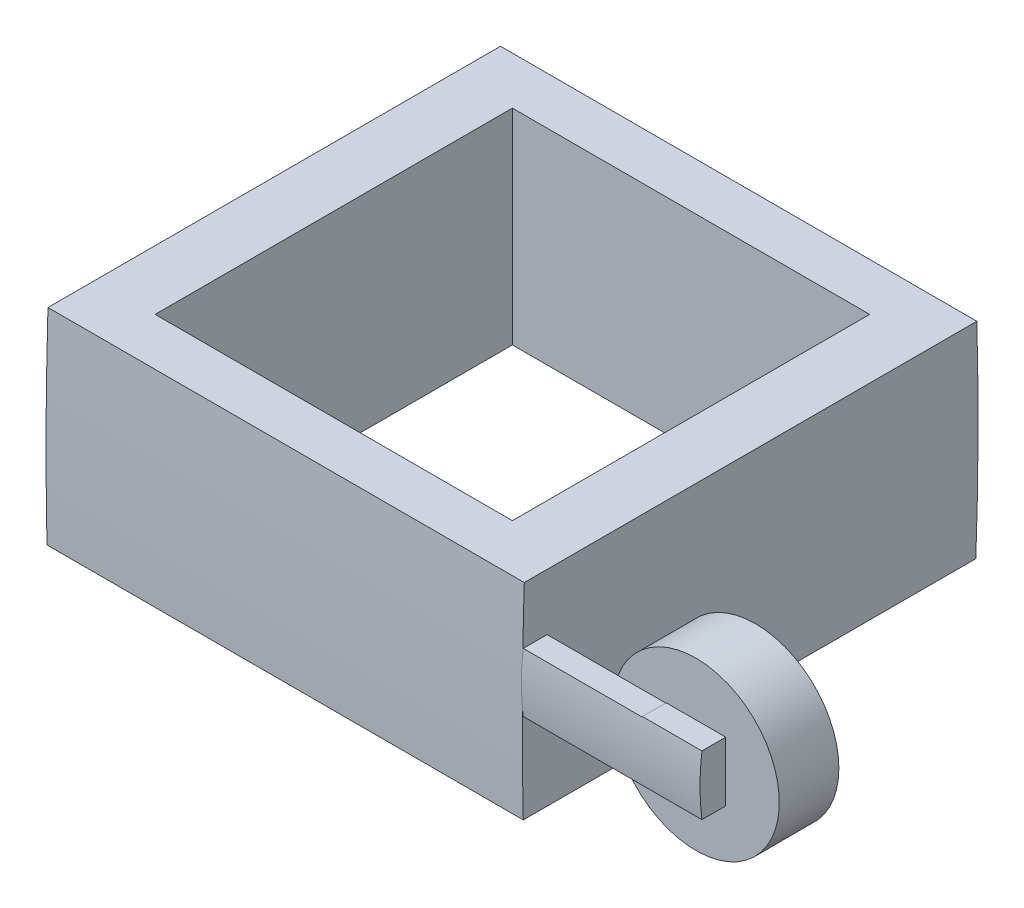
ISO-10303-21;
HEADER;
FILE_DESCRIPTION(('STEP AP214'),'2;1');
FILE_NAME('part.step','',(''),(''),'','','');
FILE_SCHEMA(('AUTOMOTIVE_DESIGN { 1 0 10303 214 1 1 1 1 }'));
ENDSEC;
DATA;
#1=APPLICATION_CONTEXT('core data for automotive mechanical design processes');
#2=APPLICATION_PROTOCOL_DEFINITION('international standard','automotive_design',2000,#1);
#3=PRODUCT_CONTEXT('',#1,'mechanical');
#4=PRODUCT('Part','Part','',(#3));
#5=PRODUCT_RELATED_PRODUCT_CATEGORY('part','',(#4));
#6=PRODUCT_DEFINITION_FORMATION('','',#4);
#7=PRODUCT_DEFINITION_CONTEXT('part definition',#1,'design');
#8=PRODUCT_DEFINITION('design','',#6,#7);
#9=PRODUCT_DEFINITION_SHAPE('','',#8);
#10=(LENGTH_UNIT() NAMED_UNIT(*) SI_UNIT(.MILLI.,.METRE.));
#11=(NAMED_UNIT(*) PLANE_ANGLE_UNIT() SI_UNIT($,.RADIAN.));
#12=(NAMED_UNIT(*) SI_UNIT($,.STERADIAN.) SOLID_ANGLE_UNIT());
#13=UNCERTAINTY_MEASURE_WITH_UNIT(LENGTH_MEASURE(1.E-05),#10,'distance_accuracy_value','');
#14=(GEOMETRIC_REPRESENTATION_CONTEXT(3) GLOBAL_UNCERTAINTY_ASSIGNED_CONTEXT((#13)) GLOBAL_UNIT_ASSIGNED_CONTEXT((#10,
#11,#12)) REPRESENTATION_CONTEXT('',''));
#15=CARTESIAN_POINT('',(0.,0.,0.));
#16=DIRECTION('',(0.,0.,1.));
#17=DIRECTION('',(1.,0.,0.));
#18=AXIS2_PLACEMENT_3D('',#15,#16,#17);
#19=CARTESIAN_POINT('',(0.,0.,10.));
#20=DIRECTION('',(0.,0.,1.));
#21=DIRECTION('',(1.,0.,0.));
#22=AXIS2_PLACEMENT_3D('',#19,#20,#21);
#23=PLANE('',#22);
#24=DIRECTION('',(1.,0.,0.));
#25=VECTOR('',#24,1.);
#26=CARTESIAN_POINT('',(-5.,-5.,10.));
#27=LINE('',#26,#25);
#28=CARTESIAN_POINT('',(-13.076696830622,-5.,10.));
#29=VERTEX_POINT('',#28);
#30=CARTESIAN_POINT('',(5.,-5.,10.));
#31=VERTEX_POINT('',#30);
#32=EDGE_CURVE('E261',#29,#31,#27,.T.);
#33=ORIENTED_EDGE('',*,*,#32,.F.);
#34=CARTESIAN_POINT('',(0.,0.,10.));
#35=DIRECTION('',(0.,0.,1.));
#36=DIRECTION('',(1.,0.,0.));
#37=AXIS2_PLACEMENT_3D('',#34,#35,#36);
#38=CIRCLE('',#37,14.);
#39=CARTESIAN_POINT('',(-13.1096817143984,4.91286528892942,10.));
#40=VERTEX_POINT('',#39);
#41=EDGE_CURVE('E281',#29,#40,#38,.T.);
#42=ORIENTED_EDGE('',*,*,#41,.T.);
#43=DIRECTION('',(1.,0.,0.));
#44=VECTOR('',#43,1.);
#45=CARTESIAN_POINT('',(-25.,4.91286528892942,10.));
#46=LINE('',#45,#44);
#47=CARTESIAN_POINT('',(-5.,4.91286528892942,10.));
#48=VERTEX_POINT('',#47);
#49=EDGE_CURVE('E244',#40,#48,#46,.T.);
#50=ORIENTED_EDGE('',*,*,#49,.T.);
#51=DIRECTION('',(0.,-1.,0.));
#52=VECTOR('',#51,1.);
#53=CARTESIAN_POINT('',(-5.,5.,10.));
#54=LINE('',#53,#52);
#55=CARTESIAN_POINT('',(-5.,5.,10.));
#56=VERTEX_POINT('',#55);
#57=EDGE_CURVE('E258',#56,#48,#54,.T.);
#58=ORIENTED_EDGE('',*,*,#57,.F.);
#59=DIRECTION('',(-1.,0.,0.));
#60=VECTOR('',#59,1.);
#61=CARTESIAN_POINT('',(-5.,5.,10.));
#62=LINE('',#61,#60);
#63=CARTESIAN_POINT('',(5.,5.,10.));
#64=VERTEX_POINT('',#63);
#65=EDGE_CURVE('E255',#64,#56,#62,.T.);
#66=ORIENTED_EDGE('',*,*,#65,.F.);
#67=DIRECTION('',(0.,1.,0.));
#68=VECTOR('',#67,1.);
#69=CARTESIAN_POINT('',(5.,5.,10.));
#70=LINE('',#69,#68);
#71=EDGE_CURVE('E252',#31,#64,#70,.T.);
#72=ORIENTED_EDGE('',*,*,#71,.F.);
#73=EDGE_LOOP('',(#33,#42,#50,#58,#66,#72));
#74=FACE_BOUND('',#73,.T.);
#75=ADVANCED_FACE('F33',(#74),#23,.T.);
#76=CARTESIAN_POINT('',(-5.,5.,18.));
#77=DIRECTION('',(1.,0.,0.));
#78=DIRECTION('',(0.,1.,0.));
#79=AXIS2_PLACEMENT_3D('',#76,#77,#78);
#80=PLANE('',#79);
#81=DIRECTION('',(0.,0.,-1.));
#82=VECTOR('',#81,1.);
#83=CARTESIAN_POINT('',(-5.,4.91286528892942,10.));
#84=LINE('',#83,#82);
#85=CARTESIAN_POINT('',(-5.,4.91286528892942,14.0114631277404));
#86=VERTEX_POINT('',#85);
#87=EDGE_CURVE('E234',#86,#48,#84,.T.);
#88=ORIENTED_EDGE('',*,*,#87,.F.);
#89=CARTESIAN_POINT('',(-5.,0.,-23.6696164036747));
#90=DIRECTION('',(1.,0.,0.));
#91=DIRECTION('',(0.,1.,0.));
#92=AXIS2_PLACEMENT_3D('',#89,#90,#91);
#93=CIRCLE('',#92,38.);
#94=CARTESIAN_POINT('',(-5.,5.,14.));
#95=VERTEX_POINT('',#94);
#96=EDGE_CURVE('E231',#86,#95,#93,.F.);
#97=ORIENTED_EDGE('',*,*,#96,.T.);
#98=DIRECTION('',(0.,0.,-1.));
#99=VECTOR('',#98,1.);
#100=CARTESIAN_POINT('',(-5.,5.,18.));
#101=LINE('',#100,#99);
#102=EDGE_CURVE('E266',#95,#56,#101,.T.);
#103=ORIENTED_EDGE('',*,*,#102,.T.);
#104=ORIENTED_EDGE('',*,*,#57,.T.);
#105=EDGE_LOOP('',(#88,#97,#103,#104));
#106=FACE_BOUND('',#105,.T.);
#107=ADVANCED_FACE('F312',(#106),#80,.F.);
#108=CARTESIAN_POINT('',(0.,0.,10.));
#109=DIRECTION('',(0.,0.,-1.));
#110=DIRECTION('',(-1.,0.,0.));
#111=AXIS2_PLACEMENT_3D('',#108,#109,#110);
#112=CYLINDRICAL_SURFACE('',#111,14.);
#113=EDGE_CURVE('E42',#40,#29,#38,.T.);
#114=ORIENTED_EDGE('',*,*,#113,.F.);
#115=ORIENTED_EDGE('',*,*,#41,.F.);
#116=EDGE_LOOP('',(#114,#115));
#117=FACE_BOUND('',#116,.T.);
#118=CARTESIAN_POINT('',(0.,0.,0.));
#119=DIRECTION('',(0.,0.,1.));
#120=DIRECTION('',(1.,0.,0.));
#121=AXIS2_PLACEMENT_3D('',#118,#119,#120);
#122=CIRCLE('',#121,14.);
#123=CARTESIAN_POINT('',(14.,0.,0.));
#124=VERTEX_POINT('',#123);
#125=EDGE_CURVE('E279',#124,#124,#122,.T.);
#126=ORIENTED_EDGE('',*,*,#125,.T.);
#127=EDGE_LOOP('',(#126));
#128=FACE_BOUND('',#127,.T.);
#129=ADVANCED_FACE('F35',(#117,#128),#112,.T.);
#130=CARTESIAN_POINT('',(0.,0.,0.));
#131=DIRECTION('',(0.,0.,1.));
#132=DIRECTION('',(1.,0.,0.));
#133=AXIS2_PLACEMENT_3D('',#130,#131,#132);
#134=PLANE('',#133);
#135=CARTESIAN_POINT('',(0.,0.,0.));
#136=DIRECTION('',(0.,0.,-1.));
#137=DIRECTION('',(-1.,0.,0.));
#138=AXIS2_PLACEMENT_3D('',#135,#136,#137);
#139=CIRCLE('',#138,5.);
#140=CARTESIAN_POINT('',(-5.,0.,0.));
#141=VERTEX_POINT('',#140);
#142=EDGE_CURVE('E270',#141,#141,#139,.T.);
#143=ORIENTED_EDGE('',*,*,#142,.F.);
#144=EDGE_LOOP('',(#143));
#145=FACE_BOUND('',#144,.T.);
#146=ORIENTED_EDGE('',*,*,#125,.F.);
#147=EDGE_LOOP('',(#146));
#148=FACE_BOUND('',#147,.T.);
#149=ADVANCED_FACE('F363',(#145,#148),#134,.F.);
#150=CARTESIAN_POINT('',(0.,0.,1.8));
#151=DIRECTION('',(0.,0.,-1.));
#152=DIRECTION('',(-1.,0.,0.));
#153=AXIS2_PLACEMENT_3D('',#150,#151,#152);
#154=PLANE('',#153);
#155=CARTESIAN_POINT('',(0.,0.,1.8));
#156=DIRECTION('',(0.,0.,-1.));
#157=DIRECTION('',(-1.,0.,0.));
#158=AXIS2_PLACEMENT_3D('',#155,#156,#157);
#159=CIRCLE('',#158,5.);
#160=CARTESIAN_POINT('',(-5.,0.,1.8));
#161=VERTEX_POINT('',#160);
#162=EDGE_CURVE('E271',#161,#161,#159,.T.);
#163=ORIENTED_EDGE('',*,*,#162,.T.);
#164=EDGE_LOOP('',(#163));
#165=FACE_BOUND('',#164,.T.);
#166=CARTESIAN_POINT('',(0.,0.,1.8));
#167=DIRECTION('',(0.,0.,-1.));
#168=DIRECTION('',(-1.,0.,0.));
#169=AXIS2_PLACEMENT_3D('',#166,#167,#168);
#170=CIRCLE('',#169,2.25);
#171=CARTESIAN_POINT('',(-2.25,0.,1.8));
#172=VERTEX_POINT('',#171);
#173=EDGE_CURVE('E37',#172,#172,#170,.F.);
#174=ORIENTED_EDGE('',*,*,#173,.T.);
#175=EDGE_LOOP('',(#174));
#176=FACE_BOUND('',#175,.T.);
#177=ADVANCED_FACE('F365',(#165,#176),#154,.T.);
#178=CARTESIAN_POINT('',(0.,0.,1.8));
#179=DIRECTION('',(0.,0.,-1.));
#180=DIRECTION('',(-1.,0.,0.));
#181=AXIS2_PLACEMENT_3D('',#178,#179,#180);
#182=CYLINDRICAL_SURFACE('',#181,5.);
#183=ORIENTED_EDGE('',*,*,#162,.F.);
#184=EDGE_LOOP('',(#183));
#185=FACE_BOUND('',#184,.T.);
#186=ORIENTED_EDGE('',*,*,#142,.T.);
#187=EDGE_LOOP('',(#186));
#188=FACE_BOUND('',#187,.T.);
#189=ADVANCED_FACE('F371',(#185,#188),#182,.F.);
#190=CARTESIAN_POINT('',(0.,0.,5.));
#191=DIRECTION('',(0.,0.,-1.));
#192=DIRECTION('',(-1.,0.,0.));
#193=AXIS2_PLACEMENT_3D('',#190,#191,#192);
#194=PLANE('',#193);
#195=CARTESIAN_POINT('',(0.,0.,5.));
#196=DIRECTION('',(0.,0.,-1.));
#197=DIRECTION('',(-1.,0.,0.));
#198=AXIS2_PLACEMENT_3D('',#195,#196,#197);
#199=CIRCLE('',#198,2.25);
#200=CARTESIAN_POINT('',(-2.25,0.,5.));
#201=VERTEX_POINT('',#200);
#202=EDGE_CURVE('E276',#201,#201,#199,.T.);
#203=ORIENTED_EDGE('',*,*,#202,.T.);
#204=EDGE_LOOP('',(#203));
#205=FACE_BOUND('',#204,.T.);
#206=ADVANCED_FACE('F378',(#205),#194,.T.);
#207=CARTESIAN_POINT('',(0.,0.,5.));
#208=DIRECTION('',(0.,0.,-1.));
#209=DIRECTION('',(-1.,0.,0.));
#210=AXIS2_PLACEMENT_3D('',#207,#208,#209);
#211=CYLINDRICAL_SURFACE('',#210,2.25);
#212=ORIENTED_EDGE('',*,*,#202,.F.);
#213=EDGE_LOOP('',(#212));
#214=FACE_BOUND('',#213,.T.);
#215=ORIENTED_EDGE('',*,*,#173,.F.);
#216=EDGE_LOOP('',(#215));
#217=FACE_BOUND('',#216,.T.);
#218=ADVANCED_FACE('F361',(#214,#217),#211,.F.);
#219=CARTESIAN_POINT('',(5.,5.,18.));
#220=DIRECTION('',(-1.,0.,0.));
#221=DIRECTION('',(0.,-1.,0.));
#222=AXIS2_PLACEMENT_3D('',#219,#220,#221);
#223=PLANE('',#222);
#224=DIRECTION('',(0.,0.,-1.));
#225=VECTOR('',#224,1.);
#226=CARTESIAN_POINT('',(5.,5.,18.));
#227=LINE('',#226,#225);
#228=CARTESIAN_POINT('',(5.,5.,14.));
#229=VERTEX_POINT('',#228);
#230=EDGE_CURVE('E268',#229,#64,#227,.T.);
#231=ORIENTED_EDGE('',*,*,#230,.F.);
#232=CARTESIAN_POINT('',(5.,0.,-23.6696164036747));
#233=DIRECTION('',(-1.,0.,0.));
#234=DIRECTION('',(0.,-1.,0.));
#235=AXIS2_PLACEMENT_3D('',#232,#233,#234);
#236=CIRCLE('',#235,38.);
#237=CARTESIAN_POINT('',(5.,-5.,14.));
#238=VERTEX_POINT('',#237);
#239=EDGE_CURVE('E216',#238,#229,#236,.T.);
#240=ORIENTED_EDGE('',*,*,#239,.F.);
#241=DIRECTION('',(0.,0.,-1.));
#242=VECTOR('',#241,1.);
#243=CARTESIAN_POINT('',(5.,-5.,18.));
#244=LINE('',#243,#242);
#245=EDGE_CURVE('E264',#238,#31,#244,.T.);
#246=ORIENTED_EDGE('',*,*,#245,.T.);
#247=ORIENTED_EDGE('',*,*,#71,.T.);
#248=EDGE_LOOP('',(#231,#240,#246,#247));
#249=FACE_BOUND('',#248,.T.);
#250=ADVANCED_FACE('F320',(#249),#223,.F.);
#251=CARTESIAN_POINT('',(-5.,5.,18.));
#252=DIRECTION('',(0.,-1.,0.));
#253=DIRECTION('',(0.,0.,-1.));
#254=AXIS2_PLACEMENT_3D('',#251,#252,#253);
#255=PLANE('',#254);
#256=ORIENTED_EDGE('',*,*,#102,.F.);
#257=DIRECTION('',(1.,0.,0.));
#258=VECTOR('',#257,1.);
#259=CARTESIAN_POINT('',(-25.,5.,14.));
#260=LINE('',#259,#258);
#261=EDGE_CURVE('E224',#95,#229,#260,.T.);
#262=ORIENTED_EDGE('',*,*,#261,.T.);
#263=ORIENTED_EDGE('',*,*,#230,.T.);
#264=ORIENTED_EDGE('',*,*,#65,.T.);
#265=EDGE_LOOP('',(#256,#262,#263,#264));
#266=FACE_BOUND('',#265,.T.);
#267=ADVANCED_FACE('F316',(#266),#255,.F.);
#268=CARTESIAN_POINT('',(-5.,-5.,18.));
#269=DIRECTION('',(0.,1.,0.));
#270=DIRECTION('',(0.,0.,1.));
#271=AXIS2_PLACEMENT_3D('',#268,#269,#270);
#272=PLANE('',#271);
#273=ORIENTED_EDGE('',*,*,#245,.F.);
#274=DIRECTION('',(1.,0.,0.));
#275=VECTOR('',#274,1.);
#276=CARTESIAN_POINT('',(-25.,-5.,14.));
#277=LINE('',#276,#275);
#278=CARTESIAN_POINT('',(-25.,-5.,14.));
#279=VERTEX_POINT('',#278);
#280=EDGE_CURVE('E220',#279,#238,#277,.T.);
#281=ORIENTED_EDGE('',*,*,#280,.F.);
#282=DIRECTION('',(0.,0.,1.));
#283=VECTOR('',#282,1.);
#284=CARTESIAN_POINT('',(-25.,-5.,10.));
#285=LINE('',#284,#283);
#286=CARTESIAN_POINT('',(-25.,-5.,10.));
#287=VERTEX_POINT('',#286);
#288=EDGE_CURVE('E238',#287,#279,#285,.T.);
#289=ORIENTED_EDGE('',*,*,#288,.F.);
#290=DIRECTION('',(1.,0.,0.));
#291=VECTOR('',#290,1.);
#292=CARTESIAN_POINT('',(-25.,-5.,10.));
#293=LINE('',#292,#291);
#294=EDGE_CURVE('E249',#287,#29,#293,.T.);
#295=ORIENTED_EDGE('',*,*,#294,.T.);
#296=ORIENTED_EDGE('',*,*,#32,.T.);
#297=EDGE_LOOP('',(#273,#281,#289,#295,#296));
#298=FACE_BOUND('',#297,.T.);
#299=ADVANCED_FACE('F299',(#298),#272,.F.);
#300=CARTESIAN_POINT('',(-25.,4.91286528892942,10.));
#301=DIRECTION('',(0.,0.,1.));
#302=DIRECTION('',(1.,0.,0.));
#303=AXIS2_PLACEMENT_3D('',#300,#301,#302);
#304=PLANE('',#303);
#305=CARTESIAN_POINT('',(-25.,4.91286528892942,10.));
#306=VERTEX_POINT('',#305);
#307=EDGE_CURVE('E246',#306,#40,#46,.T.);
#308=ORIENTED_EDGE('',*,*,#307,.T.);
#309=ORIENTED_EDGE('',*,*,#113,.T.);
#310=ORIENTED_EDGE('',*,*,#294,.F.);
#311=DIRECTION('',(0.,-1.,0.));
#312=VECTOR('',#311,1.);
#313=CARTESIAN_POINT('',(-25.,4.91286528892942,10.));
#314=LINE('',#313,#312);
#315=EDGE_CURVE('E235',#306,#287,#314,.T.);
#316=ORIENTED_EDGE('',*,*,#315,.F.);
#317=EDGE_LOOP('',(#308,#309,#310,#316));
#318=FACE_BOUND('',#317,.T.);
#319=ADVANCED_FACE('F295',(#318),#304,.F.);
#320=CARTESIAN_POINT('',(-25.,4.91286528892942,10.));
#321=DIRECTION('',(0.,-1.,0.));
#322=DIRECTION('',(1.,0.,0.));
#323=AXIS2_PLACEMENT_3D('',#320,#321,#322);
#324=PLANE('',#323);
#325=DIRECTION('',(0.,0.,-1.));
#326=VECTOR('',#325,1.);
#327=CARTESIAN_POINT('',(-25.,4.91286528892942,10.));
#328=LINE('',#327,#326);
#329=CARTESIAN_POINT('',(-25.,4.91286528892942,14.0114631277404));
#330=VERTEX_POINT('',#329);
#331=EDGE_CURVE('E241',#330,#306,#328,.T.);
#332=ORIENTED_EDGE('',*,*,#331,.F.);
#333=DIRECTION('',(1.,0.,0.));
#334=VECTOR('',#333,1.);
#335=CARTESIAN_POINT('',(-25.,4.91286528892942,14.0114631277404));
#336=LINE('',#335,#334);
#337=EDGE_CURVE('E227',#330,#86,#336,.T.);
#338=ORIENTED_EDGE('',*,*,#337,.T.);
#339=ORIENTED_EDGE('',*,*,#87,.T.);
#340=ORIENTED_EDGE('',*,*,#49,.F.);
#341=ORIENTED_EDGE('',*,*,#307,.F.);
#342=EDGE_LOOP('',(#332,#338,#339,#340,#341));
#343=FACE_BOUND('',#342,.T.);
#344=ADVANCED_FACE('F309',(#343),#324,.F.);
#345=CARTESIAN_POINT('',(-25.,0.,0.));
#346=DIRECTION('',(-1.,0.,0.));
#347=DIRECTION('',(0.,-1.,0.));
#348=AXIS2_PLACEMENT_3D('',#345,#346,#347);
#349=PLANE('',#348);
#350=CARTESIAN_POINT('',(-25.,-5.83938739683854,-602.069122819706));
#351=DIRECTION('',(-1.,0.,0.));
#352=DIRECTION('',(0.,1.,0.));
#353=AXIS2_PLACEMENT_3D('',#350,#351,#352);
#354=CIRCLE('',#353,616.232847891234);
#355=CARTESIAN_POINT('',(-25.,-3.5981456585402,14.1596493547289));
#356=VERTEX_POINT('',#355);
#357=CARTESIAN_POINT('',(-25.,4.36116541292893,14.0792939943893));
#358=VERTEX_POINT('',#357);
#359=EDGE_CURVE('E11',#356,#358,#354,.T.);
#360=ORIENTED_EDGE('',*,*,#359,.F.);
#361=CARTESIAN_POINT('',(-25.,0.,-23.6696164036747));
#362=DIRECTION('',(-1.,0.,0.));
#363=DIRECTION('',(0.,-1.,0.));
#364=AXIS2_PLACEMENT_3D('',#361,#362,#363);
#365=CIRCLE('',#364,38.);
#366=EDGE_CURVE('E221',#356,#358,#365,.T.);
#367=ORIENTED_EDGE('',*,*,#366,.T.);
#368=EDGE_LOOP('',(#360,#367));
#369=FACE_BOUND('',#368,.T.);
#370=ADVANCED_FACE('F325',(#369),#349,.T.);
#371=CARTESIAN_POINT('',(-25.,0.,-23.6696164036747));
#372=DIRECTION('',(1.,0.,0.));
#373=DIRECTION('',(0.,1.,0.));
#374=AXIS2_PLACEMENT_3D('',#371,#372,#373);
#375=CYLINDRICAL_SURFACE('',#374,38.);
#376=ORIENTED_EDGE('',*,*,#337,.F.);
#377=EDGE_CURVE('E222',#358,#330,#365,.T.);
#378=ORIENTED_EDGE('',*,*,#377,.F.);
#379=ORIENTED_EDGE('',*,*,#366,.F.);
#380=EDGE_CURVE('E217',#279,#356,#365,.T.);
#381=ORIENTED_EDGE('',*,*,#380,.F.);
#382=ORIENTED_EDGE('',*,*,#280,.T.);
#383=ORIENTED_EDGE('',*,*,#239,.T.);
#384=ORIENTED_EDGE('',*,*,#261,.F.);
#385=ORIENTED_EDGE('',*,*,#96,.F.);
#386=EDGE_LOOP('',(#376,#378,#379,#381,#382,#383,#384,#385));
#387=FACE_BOUND('',#386,.T.);
#388=ADVANCED_FACE('F322',(#387),#375,.T.);
#389=CARTESIAN_POINT('',(-105.,-0.220068821104443,468.323560821229));
#390=DIRECTION('',(1.,0.,0.));
#391=DIRECTION('',(0.,1.,0.));
#392=AXIS2_PLACEMENT_3D('',#389,#390,#391);
#393=CYLINDRICAL_SURFACE('',#392,530.693932748672);
#394=CARTESIAN_POINT('',(-25.,-0.220068821104429,468.323560821229));
#395=DIRECTION('',(-1.,0.,0.));
#396=DIRECTION('',(0.,1.,0.));
#397=AXIS2_PLACEMENT_3D('',#394,#395,#396);
#398=CIRCLE('',#397,530.693932748672);
#399=CARTESIAN_POINT('',(-25.,14.4035859028628,-62.1688509800772));
#400=VERTEX_POINT('',#399);
#401=CARTESIAN_POINT('',(-25.,-20.0435673555353,-62.0000000000001));
#402=VERTEX_POINT('',#401);
#403=EDGE_CURVE('E187',#400,#402,#398,.T.);
#404=ORIENTED_EDGE('',*,*,#403,.T.);
#405=DIRECTION('',(1.,0.,0.));
#406=VECTOR('',#405,1.);
#407=CARTESIAN_POINT('',(-105.,-20.0435673555353,-62.0000000000001));
#408=LINE('',#407,#406);
#409=CARTESIAN_POINT('',(-105.,-20.0435673555353,-62.0000000000001));
#410=VERTEX_POINT('',#409);
#411=EDGE_CURVE('E213',#410,#402,#408,.T.);
#412=ORIENTED_EDGE('',*,*,#411,.F.);
#413=CARTESIAN_POINT('',(-105.,-0.220068821104443,468.323560821229));
#414=DIRECTION('',(-1.,0.,0.));
#415=DIRECTION('',(0.,1.,0.));
#416=AXIS2_PLACEMENT_3D('',#413,#414,#415);
#417=CIRCLE('',#416,530.693932748672);
#418=CARTESIAN_POINT('',(-105.,14.4035859028628,-62.1688509800772));
#419=VERTEX_POINT('',#418);
#420=EDGE_CURVE('E188',#419,#410,#417,.T.);
#421=ORIENTED_EDGE('',*,*,#420,.F.);
#422=DIRECTION('',(1.,0.,0.));
#423=VECTOR('',#422,1.);
#424=CARTESIAN_POINT('',(-105.,14.4035859028628,-62.1688509800772));
#425=LINE('',#424,#423);
#426=EDGE_CURVE('E198',#419,#400,#425,.T.);
#427=ORIENTED_EDGE('',*,*,#426,.T.);
#428=EDGE_LOOP('',(#404,#412,#421,#427));
#429=FACE_BOUND('',#428,.T.);
#430=ADVANCED_FACE('F338',(#429),#393,.T.);
#431=CARTESIAN_POINT('',(-105.,-20.0435673555353,-62.0000000000001));
#432=DIRECTION('',(0.,1.,0.));
#433=DIRECTION('',(-1.,0.,0.));
#434=AXIS2_PLACEMENT_3D('',#431,#432,#433);
#435=PLANE('',#434);
#436=DIRECTION('',(-1.,0.,0.));
#437=VECTOR('',#436,1.);
#438=CARTESIAN_POINT('',(-105.,-20.0435673555353,-54.1688509800772));
#439=LINE('',#438,#437);
#440=CARTESIAN_POINT('',(-35.,-20.0435673555353,-54.1688509800772));
#441=VERTEX_POINT('',#440);
#442=CARTESIAN_POINT('',(-95.,-20.0435673555353,-54.1688509800772));
#443=VERTEX_POINT('',#442);
#444=EDGE_CURVE('E181',#441,#443,#439,.T.);
#445=ORIENTED_EDGE('',*,*,#444,.T.);
#446=DIRECTION('',(0.,0.,1.));
#447=VECTOR('',#446,1.);
#448=CARTESIAN_POINT('',(-95.,-20.0435673555353,-62.0000000000001));
#449=LINE('',#448,#447);
#450=CARTESIAN_POINT('',(-95.,-20.0435673555353,5.83114901992285));
#451=VERTEX_POINT('',#450);
#452=EDGE_CURVE('E184',#443,#451,#449,.T.);
#453=ORIENTED_EDGE('',*,*,#452,.T.);
#454=DIRECTION('',(1.,0.,0.));
#455=VECTOR('',#454,1.);
#456=CARTESIAN_POINT('',(-105.,-20.0435673555353,5.83114901992285));
#457=LINE('',#456,#455);
#458=CARTESIAN_POINT('',(-35.,-20.0435673555353,5.83114901992284));
#459=VERTEX_POINT('',#458);
#460=EDGE_CURVE('E176',#451,#459,#457,.T.);
#461=ORIENTED_EDGE('',*,*,#460,.T.);
#462=DIRECTION('',(0.,0.,-1.));
#463=VECTOR('',#462,1.);
#464=CARTESIAN_POINT('',(-35.,-20.0435673555353,-62.0000000000001));
#465=LINE('',#464,#463);
#466=EDGE_CURVE('E156',#459,#441,#465,.T.);
#467=ORIENTED_EDGE('',*,*,#466,.T.);
#468=EDGE_LOOP('',(#445,#453,#461,#467));
#469=FACE_BOUND('',#468,.T.);
#470=DIRECTION('',(0.,0.,1.));
#471=VECTOR('',#470,1.);
#472=CARTESIAN_POINT('',(-25.,-20.0435673555353,-62.0000000000001));
#473=LINE('',#472,#471);
#474=CARTESIAN_POINT('',(-25.,-20.0435673555353,14.));
#475=VERTEX_POINT('',#474);
#476=EDGE_CURVE('E201',#402,#475,#473,.T.);
#477=ORIENTED_EDGE('',*,*,#476,.T.);
#478=DIRECTION('',(1.,0.,0.));
#479=VECTOR('',#478,1.);
#480=CARTESIAN_POINT('',(-105.,-20.0435673555353,14.));
#481=LINE('',#480,#479);
#482=CARTESIAN_POINT('',(-105.,-20.0435673555353,14.));
#483=VERTEX_POINT('',#482);
#484=EDGE_CURVE('E210',#483,#475,#481,.T.);
#485=ORIENTED_EDGE('',*,*,#484,.F.);
#486=DIRECTION('',(0.,0.,1.));
#487=VECTOR('',#486,1.);
#488=CARTESIAN_POINT('',(-105.,-20.0435673555353,-62.0000000000001));
#489=LINE('',#488,#487);
#490=EDGE_CURVE('E191',#410,#483,#489,.T.);
#491=ORIENTED_EDGE('',*,*,#490,.F.);
#492=ORIENTED_EDGE('',*,*,#411,.T.);
#493=EDGE_LOOP('',(#477,#485,#491,#492));
#494=FACE_BOUND('',#493,.T.);
#495=ADVANCED_FACE('F335',(#469,#494),#435,.F.);
#496=CARTESIAN_POINT('',(-105.,-5.83938739683855,-602.069122819706));
#497=DIRECTION('',(1.,0.,0.));
#498=DIRECTION('',(0.,1.,0.));
#499=AXIS2_PLACEMENT_3D('',#496,#497,#498);
#500=CYLINDRICAL_SURFACE('',#499,616.232847891234);
#501=EDGE_CURVE('E44',#475,#356,#354,.T.);
#502=ORIENTED_EDGE('',*,*,#501,.T.);
#503=ORIENTED_EDGE('',*,*,#359,.T.);
#504=CARTESIAN_POINT('',(-25.,14.4035859028628,13.8311490199229));
#505=VERTEX_POINT('',#504);
#506=EDGE_CURVE('E45',#358,#505,#354,.T.);
#507=ORIENTED_EDGE('',*,*,#506,.T.);
#508=DIRECTION('',(1.,0.,0.));
#509=VECTOR('',#508,1.);
#510=CARTESIAN_POINT('',(-105.,14.4035859028628,13.8311490199229));
#511=LINE('',#510,#509);
#512=CARTESIAN_POINT('',(-105.,14.4035859028628,13.8311490199229));
#513=VERTEX_POINT('',#512);
#514=EDGE_CURVE('E207',#513,#505,#511,.T.);
#515=ORIENTED_EDGE('',*,*,#514,.F.);
#516=CARTESIAN_POINT('',(-105.,-5.83938739683855,-602.069122819706));
#517=DIRECTION('',(-1.,0.,0.));
#518=DIRECTION('',(0.,1.,0.));
#519=AXIS2_PLACEMENT_3D('',#516,#517,#518);
#520=CIRCLE('',#519,616.232847891234);
#521=EDGE_CURVE('E194',#483,#513,#520,.T.);
#522=ORIENTED_EDGE('',*,*,#521,.F.);
#523=ORIENTED_EDGE('',*,*,#484,.T.);
#524=EDGE_LOOP('',(#502,#503,#507,#515,#522,#523));
#525=FACE_BOUND('',#524,.T.);
#526=ADVANCED_FACE('F327',(#525),#500,.T.);
#527=CARTESIAN_POINT('',(-105.,14.4035859028628,-62.1688509800772));
#528=DIRECTION('',(0.,-1.,0.));
#529=DIRECTION('',(1.,0.,0.));
#530=AXIS2_PLACEMENT_3D('',#527,#528,#529);
#531=PLANE('',#530);
#532=DIRECTION('',(1.,0.,0.));
#533=VECTOR('',#532,1.);
#534=CARTESIAN_POINT('',(-35.,14.4035859028628,5.83114901992284));
#535=LINE('',#534,#533);
#536=CARTESIAN_POINT('',(-95.,14.4035859028628,5.83114901992285));
#537=VERTEX_POINT('',#536);
#538=CARTESIAN_POINT('',(-35.,14.4035859028628,5.83114901992284));
#539=VERTEX_POINT('',#538);
#540=EDGE_CURVE('E162',#537,#539,#535,.T.);
#541=ORIENTED_EDGE('',*,*,#540,.F.);
#542=DIRECTION('',(0.,0.,1.));
#543=VECTOR('',#542,1.);
#544=CARTESIAN_POINT('',(-95.,14.4035859028628,5.83114901992285));
#545=LINE('',#544,#543);
#546=CARTESIAN_POINT('',(-95.,14.4035859028628,-54.1688509800772));
#547=VERTEX_POINT('',#546);
#548=EDGE_CURVE('E60',#547,#537,#545,.T.);
#549=ORIENTED_EDGE('',*,*,#548,.F.);
#550=DIRECTION('',(-1.,0.,0.));
#551=VECTOR('',#550,1.);
#552=CARTESIAN_POINT('',(-35.,14.4035859028628,-54.1688509800772));
#553=LINE('',#552,#551);
#554=CARTESIAN_POINT('',(-35.,14.4035859028628,-54.1688509800772));
#555=VERTEX_POINT('',#554);
#556=EDGE_CURVE('E169',#555,#547,#553,.T.);
#557=ORIENTED_EDGE('',*,*,#556,.F.);
#558=DIRECTION('',(0.,0.,-1.));
#559=VECTOR('',#558,1.);
#560=CARTESIAN_POINT('',(-35.,14.4035859028628,5.83114901992284));
#561=LINE('',#560,#559);
#562=EDGE_CURVE('E153',#539,#555,#561,.T.);
#563=ORIENTED_EDGE('',*,*,#562,.F.);
#564=EDGE_LOOP('',(#541,#549,#557,#563));
#565=FACE_BOUND('',#564,.T.);
#566=DIRECTION('',(0.,0.,-1.));
#567=VECTOR('',#566,1.);
#568=CARTESIAN_POINT('',(-25.,14.4035859028628,-62.1688509800772));
#569=LINE('',#568,#567);
#570=EDGE_CURVE('E192',#505,#400,#569,.T.);
#571=ORIENTED_EDGE('',*,*,#570,.T.);
#572=ORIENTED_EDGE('',*,*,#426,.F.);
#573=DIRECTION('',(0.,0.,-1.));
#574=VECTOR('',#573,1.);
#575=CARTESIAN_POINT('',(-105.,14.4035859028628,-62.1688509800772));
#576=LINE('',#575,#574);
#577=EDGE_CURVE('E196',#513,#419,#576,.T.);
#578=ORIENTED_EDGE('',*,*,#577,.F.);
#579=ORIENTED_EDGE('',*,*,#514,.T.);
#580=EDGE_LOOP('',(#571,#572,#578,#579));
#581=FACE_BOUND('',#580,.T.);
#582=ADVANCED_FACE('F166',(#565,#581),#531,.F.);
#583=CARTESIAN_POINT('',(-105.,-0.220068821104443,468.323560821229));
#584=DIRECTION('',(1.,0.,0.));
#585=DIRECTION('',(0.,1.,0.));
#586=AXIS2_PLACEMENT_3D('',#583,#584,#585);
#587=PLANE('',#586);
#588=ORIENTED_EDGE('',*,*,#420,.T.);
#589=ORIENTED_EDGE('',*,*,#490,.T.);
#590=ORIENTED_EDGE('',*,*,#521,.T.);
#591=ORIENTED_EDGE('',*,*,#577,.T.);
#592=EDGE_LOOP('',(#588,#589,#590,#591));
#593=FACE_BOUND('',#592,.T.);
#594=ADVANCED_FACE('F342',(#593),#587,.F.);
#595=CARTESIAN_POINT('',(-25.,-0.220068821104429,468.323560821229));
#596=DIRECTION('',(1.,0.,0.));
#597=DIRECTION('',(0.,1.,0.));
#598=AXIS2_PLACEMENT_3D('',#595,#596,#597);
#599=PLANE('',#598);
#600=ORIENTED_EDGE('',*,*,#288,.T.);
#601=ORIENTED_EDGE('',*,*,#380,.T.);
#602=ORIENTED_EDGE('',*,*,#501,.F.);
#603=ORIENTED_EDGE('',*,*,#476,.F.);
#604=ORIENTED_EDGE('',*,*,#403,.F.);
#605=ORIENTED_EDGE('',*,*,#570,.F.);
#606=ORIENTED_EDGE('',*,*,#506,.F.);
#607=ORIENTED_EDGE('',*,*,#377,.T.);
#608=ORIENTED_EDGE('',*,*,#331,.T.);
#609=ORIENTED_EDGE('',*,*,#315,.T.);
#610=EDGE_LOOP('',(#600,#601,#602,#603,#604,#605,#606,#607,#608,#609));
#611=FACE_BOUND('',#610,.T.);
#612=ADVANCED_FACE('F302',(#611),#599,.T.);
#613=CARTESIAN_POINT('',(-95.,-85.5964140971372,5.83114901992285));
#614=DIRECTION('',(-1.,0.,0.));
#615=DIRECTION('',(0.,-1.,0.));
#616=AXIS2_PLACEMENT_3D('',#613,#614,#615);
#617=PLANE('',#616);
#618=DIRECTION('',(0.,1.,0.));
#619=VECTOR('',#618,1.);
#620=CARTESIAN_POINT('',(-95.,-85.5964140971372,-54.1688509800772));
#621=LINE('',#620,#619);
#622=EDGE_CURVE('E174',#443,#547,#621,.T.);
#623=ORIENTED_EDGE('',*,*,#622,.T.);
#624=ORIENTED_EDGE('',*,*,#548,.T.);
#625=DIRECTION('',(0.,1.,0.));
#626=VECTOR('',#625,1.);
#627=CARTESIAN_POINT('',(-95.,-85.5964140971372,5.83114901992285));
#628=LINE('',#627,#626);
#629=EDGE_CURVE('E159',#451,#537,#628,.T.);
#630=ORIENTED_EDGE('',*,*,#629,.F.);
#631=ORIENTED_EDGE('',*,*,#452,.F.);
#632=EDGE_LOOP('',(#623,#624,#630,#631));
#633=FACE_BOUND('',#632,.T.);
#634=ADVANCED_FACE('F349',(#633),#617,.F.);
#635=CARTESIAN_POINT('',(-35.,-85.5964140971372,-54.1688509800772));
#636=DIRECTION('',(0.,0.,-1.));
#637=DIRECTION('',(-1.,0.,0.));
#638=AXIS2_PLACEMENT_3D('',#635,#636,#637);
#639=PLANE('',#638);
#640=DIRECTION('',(0.,1.,0.));
#641=VECTOR('',#640,1.);
#642=CARTESIAN_POINT('',(-35.,-85.5964140971372,-54.1688509800772));
#643=LINE('',#642,#641);
#644=EDGE_CURVE('E158',#441,#555,#643,.T.);
#645=ORIENTED_EDGE('',*,*,#644,.T.);
#646=ORIENTED_EDGE('',*,*,#556,.T.);
#647=ORIENTED_EDGE('',*,*,#622,.F.);
#648=ORIENTED_EDGE('',*,*,#444,.F.);
#649=EDGE_LOOP('',(#645,#646,#647,#648));
#650=FACE_BOUND('',#649,.T.);
#651=ADVANCED_FACE('F428',(#650),#639,.F.);
#652=CARTESIAN_POINT('',(-35.,-85.5964140971372,5.83114901992284));
#653=DIRECTION('',(1.,0.,0.));
#654=DIRECTION('',(0.,1.,0.));
#655=AXIS2_PLACEMENT_3D('',#652,#653,#654);
#656=PLANE('',#655);
#657=DIRECTION('',(0.,1.,0.));
#658=VECTOR('',#657,1.);
#659=CARTESIAN_POINT('',(-35.,-85.5964140971372,5.83114901992284));
#660=LINE('',#659,#658);
#661=EDGE_CURVE('E52',#459,#539,#660,.T.);
#662=ORIENTED_EDGE('',*,*,#661,.T.);
#663=ORIENTED_EDGE('',*,*,#562,.T.);
#664=ORIENTED_EDGE('',*,*,#644,.F.);
#665=ORIENTED_EDGE('',*,*,#466,.F.);
#666=EDGE_LOOP('',(#662,#663,#664,#665));
#667=FACE_BOUND('',#666,.T.);
#668=ADVANCED_FACE('F150',(#667),#656,.F.);
#669=CARTESIAN_POINT('',(-35.,-85.5964140971372,5.83114901992284));
#670=DIRECTION('',(0.,0.,1.));
#671=DIRECTION('',(1.,0.,0.));
#672=AXIS2_PLACEMENT_3D('',#669,#670,#671);
#673=PLANE('',#672);
#674=ORIENTED_EDGE('',*,*,#629,.T.);
#675=ORIENTED_EDGE('',*,*,#540,.T.);
#676=ORIENTED_EDGE('',*,*,#661,.F.);
#677=ORIENTED_EDGE('',*,*,#460,.F.);
#678=EDGE_LOOP('',(#674,#675,#676,#677));
#679=FACE_BOUND('',#678,.T.);
#680=ADVANCED_FACE('F163',(#679),#673,.F.);
#681=CLOSED_SHELL('',(#75,#107,#129,#149,#177,#189,#206,#218,#250,#267,#299,#319,#344,#370,#388,
#430,#495,#526,#582,#594,#612,#634,#651,#668,#680));
#682=MANIFOLD_SOLID_BREP('B2',#681);
#683=ADVANCED_BREP_SHAPE_REPRESENTATION('',(#18,#682),#14);
#684=SHAPE_DEFINITION_REPRESENTATION(#9,#683);
ENDSEC;
END-ISO-10303-21;
